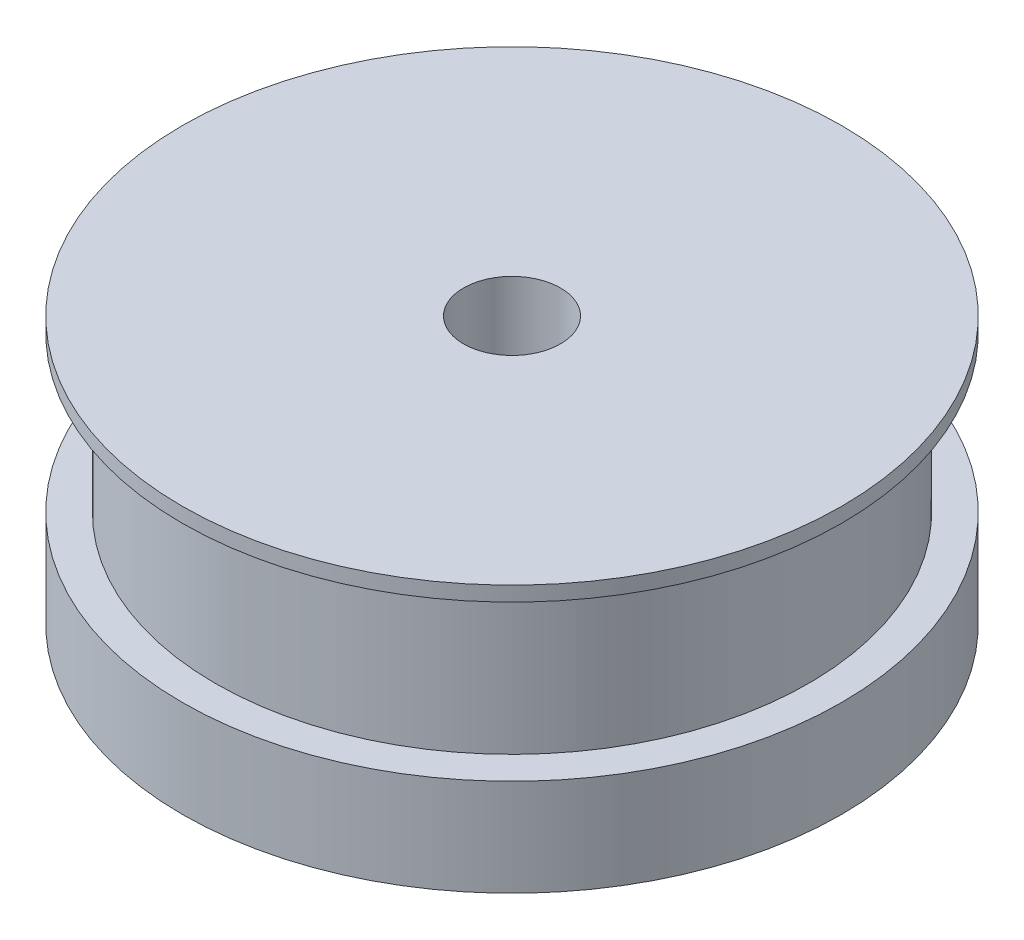
ISO-10303-21;
HEADER;
FILE_DESCRIPTION(('STEP AP214'),'2;1');
FILE_NAME('part.step','',(''),(''),'','','');
FILE_SCHEMA(('AUTOMOTIVE_DESIGN { 1 0 10303 214 1 1 1 1 }'));
ENDSEC;
DATA;
#1=APPLICATION_CONTEXT('core data for automotive mechanical design processes');
#2=APPLICATION_PROTOCOL_DEFINITION('international standard','automotive_design',2000,#1);
#3=PRODUCT_CONTEXT('',#1,'mechanical');
#4=PRODUCT('Part','Part','',(#3));
#5=PRODUCT_RELATED_PRODUCT_CATEGORY('part','',(#4));
#6=PRODUCT_DEFINITION_FORMATION('','',#4);
#7=PRODUCT_DEFINITION_CONTEXT('part definition',#1,'design');
#8=PRODUCT_DEFINITION('design','',#6,#7);
#9=PRODUCT_DEFINITION_SHAPE('','',#8);
#10=(LENGTH_UNIT() NAMED_UNIT(*) SI_UNIT(.MILLI.,.METRE.));
#11=(NAMED_UNIT(*) PLANE_ANGLE_UNIT() SI_UNIT($,.RADIAN.));
#12=(NAMED_UNIT(*) SI_UNIT($,.STERADIAN.) SOLID_ANGLE_UNIT());
#13=UNCERTAINTY_MEASURE_WITH_UNIT(LENGTH_MEASURE(1.E-05),#10,'distance_accuracy_value','');
#14=(GEOMETRIC_REPRESENTATION_CONTEXT(3) GLOBAL_UNCERTAINTY_ASSIGNED_CONTEXT((#13)) GLOBAL_UNIT_ASSIGNED_CONTEXT((#10,
#11,#12)) REPRESENTATION_CONTEXT('',''));
#15=CARTESIAN_POINT('',(0.,0.,0.));
#16=DIRECTION('',(0.,0.,1.));
#17=DIRECTION('',(1.,0.,0.));
#18=AXIS2_PLACEMENT_3D('',#15,#16,#17);
#19=CARTESIAN_POINT('',(0.,17.4752,0.));
#20=DIRECTION('',(0.,-1.,0.));
#21=DIRECTION('',(0.,0.,-1.));
#22=AXIS2_PLACEMENT_3D('',#19,#20,#21);
#23=CYLINDRICAL_SURFACE('',#22,21.59);
#24=CARTESIAN_POINT('',(0.,0.,0.));
#25=DIRECTION('',(0.,1.,0.));
#26=DIRECTION('',(0.,0.,1.));
#27=AXIS2_PLACEMENT_3D('',#24,#25,#26);
#28=CIRCLE('',#27,21.59);
#29=CARTESIAN_POINT('',(0.,0.,21.59));
#30=VERTEX_POINT('',#29);
#31=EDGE_CURVE('E36',#30,#30,#28,.T.);
#32=ORIENTED_EDGE('',*,*,#31,.T.);
#33=EDGE_LOOP('',(#32));
#34=FACE_BOUND('',#33,.T.);
#35=CARTESIAN_POINT('',(0.,6.35,0.));
#36=DIRECTION('',(0.,1.,0.));
#37=DIRECTION('',(0.,0.,1.));
#38=AXIS2_PLACEMENT_3D('',#35,#36,#37);
#39=CIRCLE('',#38,21.59);
#40=CARTESIAN_POINT('',(0.,6.35,21.59));
#41=VERTEX_POINT('',#40);
#42=EDGE_CURVE('E43',#41,#41,#39,.T.);
#43=ORIENTED_EDGE('',*,*,#42,.F.);
#44=EDGE_LOOP('',(#43));
#45=FACE_BOUND('',#44,.T.);
#46=ADVANCED_FACE('F33',(#34,#45),#23,.T.);
#47=CARTESIAN_POINT('',(0.,0.,0.));
#48=DIRECTION('',(0.,1.,0.));
#49=DIRECTION('',(0.,0.,1.));
#50=AXIS2_PLACEMENT_3D('',#47,#48,#49);
#51=PLANE('',#50);
#52=CARTESIAN_POINT('',(0.,0.,0.));
#53=DIRECTION('',(0.,1.,0.));
#54=DIRECTION('',(0.,0.,1.));
#55=AXIS2_PLACEMENT_3D('',#52,#53,#54);
#56=CIRCLE('',#55,3.175);
#57=CARTESIAN_POINT('',(0.,0.,3.175));
#58=VERTEX_POINT('',#57);
#59=EDGE_CURVE('E56',#58,#58,#56,.T.);
#60=ORIENTED_EDGE('',*,*,#59,.T.);
#61=EDGE_LOOP('',(#60));
#62=FACE_BOUND('',#61,.T.);
#63=ORIENTED_EDGE('',*,*,#31,.F.);
#64=EDGE_LOOP('',(#63));
#65=FACE_BOUND('',#64,.T.);
#66=ADVANCED_FACE('F63',(#62,#65),#51,.F.);
#67=CARTESIAN_POINT('',(0.,6.35,-21.59));
#68=DIRECTION('',(0.,1.,0.));
#69=DIRECTION('',(0.,0.,1.));
#70=AXIS2_PLACEMENT_3D('',#67,#68,#69);
#71=PLANE('',#70);
#72=ORIENTED_EDGE('',*,*,#42,.T.);
#73=EDGE_LOOP('',(#72));
#74=FACE_BOUND('',#73,.T.);
#75=CARTESIAN_POINT('',(0.,6.35,0.));
#76=DIRECTION('',(0.,1.,0.));
#77=DIRECTION('',(0.,0.,1.));
#78=AXIS2_PLACEMENT_3D('',#75,#76,#77);
#79=CIRCLE('',#78,19.431);
#80=CARTESIAN_POINT('',(0.,6.35,19.431));
#81=VERTEX_POINT('',#80);
#82=EDGE_CURVE('E47',#81,#81,#79,.T.);
#83=ORIENTED_EDGE('',*,*,#82,.F.);
#84=EDGE_LOOP('',(#83));
#85=FACE_BOUND('',#84,.T.);
#86=ADVANCED_FACE('F91',(#74,#85),#71,.T.);
#87=CARTESIAN_POINT('',(0.,18.3093316774291,0.));
#88=DIRECTION('',(0.,1.,0.));
#89=DIRECTION('',(0.,0.,1.));
#90=AXIS2_PLACEMENT_3D('',#87,#88,#89);
#91=CYLINDRICAL_SURFACE('',#90,19.431);
#92=ORIENTED_EDGE('',*,*,#82,.T.);
#93=EDGE_LOOP('',(#92));
#94=FACE_BOUND('',#93,.T.);
#95=CARTESIAN_POINT('',(0.,16.51,0.));
#96=DIRECTION('',(0.,1.,0.));
#97=DIRECTION('',(0.,0.,1.));
#98=AXIS2_PLACEMENT_3D('',#95,#96,#97);
#99=CIRCLE('',#98,19.431);
#100=CARTESIAN_POINT('',(0.,16.51,19.431));
#101=VERTEX_POINT('',#100);
#102=EDGE_CURVE('E50',#101,#101,#99,.T.);
#103=ORIENTED_EDGE('',*,*,#102,.F.);
#104=EDGE_LOOP('',(#103));
#105=FACE_BOUND('',#104,.T.);
#106=ADVANCED_FACE('F82',(#94,#105),#91,.T.);
#107=CARTESIAN_POINT('',(0.,16.51,-21.59));
#108=DIRECTION('',(0.,-1.,0.));
#109=DIRECTION('',(0.,0.,-1.));
#110=AXIS2_PLACEMENT_3D('',#107,#108,#109);
#111=PLANE('',#110);
#112=ORIENTED_EDGE('',*,*,#102,.T.);
#113=EDGE_LOOP('',(#112));
#114=FACE_BOUND('',#113,.T.);
#115=CARTESIAN_POINT('',(0.,16.51,0.));
#116=DIRECTION('',(0.,1.,0.));
#117=DIRECTION('',(0.,0.,1.));
#118=AXIS2_PLACEMENT_3D('',#115,#116,#117);
#119=CIRCLE('',#118,21.59);
#120=CARTESIAN_POINT('',(0.,16.51,21.59));
#121=VERTEX_POINT('',#120);
#122=EDGE_CURVE('E53',#121,#121,#119,.T.);
#123=ORIENTED_EDGE('',*,*,#122,.F.);
#124=EDGE_LOOP('',(#123));
#125=FACE_BOUND('',#124,.T.);
#126=ADVANCED_FACE('F75',(#114,#125),#111,.T.);
#127=CARTESIAN_POINT('',(0.,17.4752,0.));
#128=DIRECTION('',(0.,1.,0.));
#129=DIRECTION('',(0.,0.,1.));
#130=AXIS2_PLACEMENT_3D('',#127,#128,#129);
#131=PLANE('',#130);
#132=CARTESIAN_POINT('',(0.,17.4752,0.));
#133=DIRECTION('',(0.,1.,0.));
#134=DIRECTION('',(0.,0.,1.));
#135=AXIS2_PLACEMENT_3D('',#132,#133,#134);
#136=CIRCLE('',#135,3.175);
#137=CARTESIAN_POINT('',(0.,17.4752,3.175));
#138=VERTEX_POINT('',#137);
#139=EDGE_CURVE('E57',#138,#138,#136,.T.);
#140=ORIENTED_EDGE('',*,*,#139,.F.);
#141=EDGE_LOOP('',(#140));
#142=FACE_BOUND('',#141,.T.);
#143=CARTESIAN_POINT('',(0.,17.4752,0.));
#144=DIRECTION('',(0.,1.,0.));
#145=DIRECTION('',(0.,0.,1.));
#146=AXIS2_PLACEMENT_3D('',#143,#144,#145);
#147=CIRCLE('',#146,21.59);
#148=CARTESIAN_POINT('',(0.,17.4752,21.59));
#149=VERTEX_POINT('',#148);
#150=EDGE_CURVE('E10',#149,#149,#147,.T.);
#151=ORIENTED_EDGE('',*,*,#150,.T.);
#152=EDGE_LOOP('',(#151));
#153=FACE_BOUND('',#152,.T.);
#154=ADVANCED_FACE('F73',(#142,#153),#131,.T.);
#155=ORIENTED_EDGE('',*,*,#150,.F.);
#156=EDGE_LOOP('',(#155));
#157=FACE_BOUND('',#156,.T.);
#158=ORIENTED_EDGE('',*,*,#122,.T.);
#159=EDGE_LOOP('',(#158));
#160=FACE_BOUND('',#159,.T.);
#161=ADVANCED_FACE('F69',(#157,#160),#23,.T.);
#162=CARTESIAN_POINT('',(0.,0.,0.));
#163=DIRECTION('',(0.,1.,0.));
#164=DIRECTION('',(0.,0.,1.));
#165=AXIS2_PLACEMENT_3D('',#162,#163,#164);
#166=CYLINDRICAL_SURFACE('',#165,3.175);
#167=ORIENTED_EDGE('',*,*,#59,.F.);
#168=EDGE_LOOP('',(#167));
#169=FACE_BOUND('',#168,.T.);
#170=ORIENTED_EDGE('',*,*,#139,.T.);
#171=EDGE_LOOP('',(#170));
#172=FACE_BOUND('',#171,.T.);
#173=ADVANCED_FACE('F66',(#169,#172),#166,.F.);
#174=CLOSED_SHELL('',(#46,#66,#86,#106,#126,#154,#161,#173));
#175=MANIFOLD_SOLID_BREP('B2',#174);
#176=ADVANCED_BREP_SHAPE_REPRESENTATION('',(#18,#175),#14);
#177=SHAPE_DEFINITION_REPRESENTATION(#9,#176);
ENDSEC;
END-ISO-10303-21;
